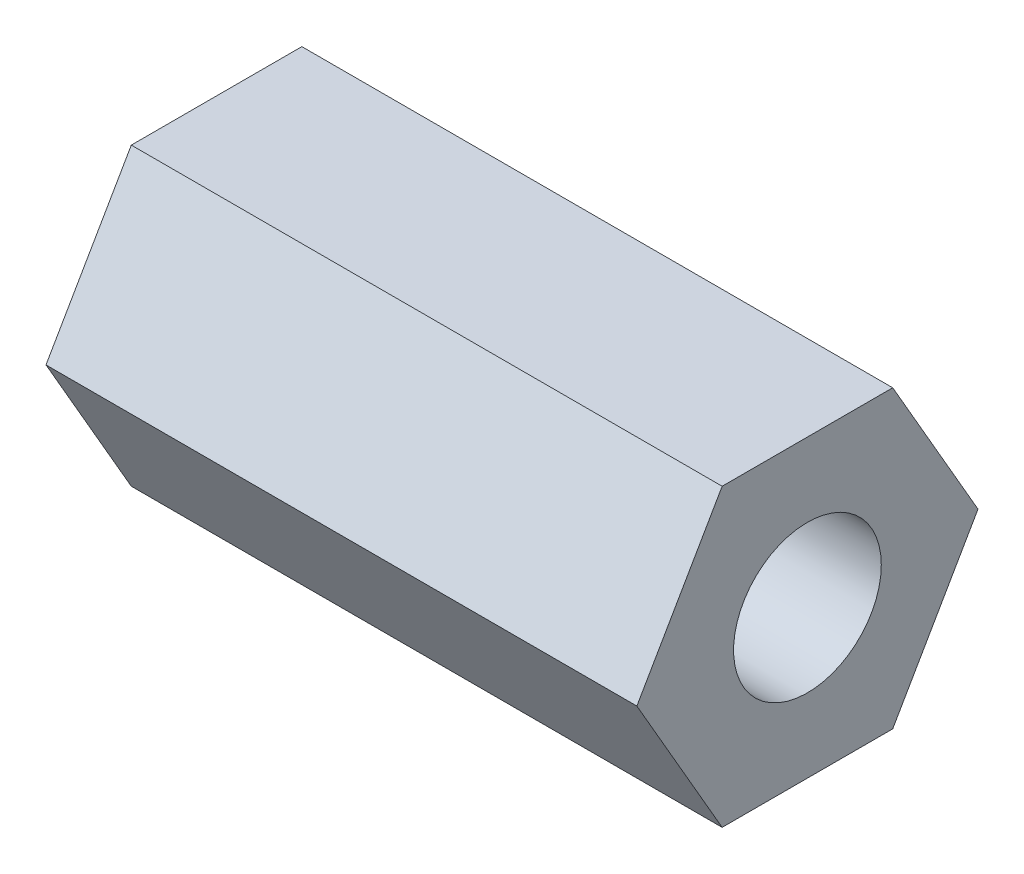
ISO-10303-21;
HEADER;
FILE_DESCRIPTION(('STEP AP214'),'2;1');
FILE_NAME('part.step','',(''),(''),'','','');
FILE_SCHEMA(('AUTOMOTIVE_DESIGN { 1 0 10303 214 1 1 1 1 }'));
ENDSEC;
DATA;
#1=APPLICATION_CONTEXT('core data for automotive mechanical design processes');
#2=APPLICATION_PROTOCOL_DEFINITION('international standard','automotive_design',2000,#1);
#3=PRODUCT_CONTEXT('',#1,'mechanical');
#4=PRODUCT('Part','Part','',(#3));
#5=PRODUCT_RELATED_PRODUCT_CATEGORY('part','',(#4));
#6=PRODUCT_DEFINITION_FORMATION('','',#4);
#7=PRODUCT_DEFINITION_CONTEXT('part definition',#1,'design');
#8=PRODUCT_DEFINITION('design','',#6,#7);
#9=PRODUCT_DEFINITION_SHAPE('','',#8);
#10=(LENGTH_UNIT() NAMED_UNIT(*) SI_UNIT(.MILLI.,.METRE.));
#11=(NAMED_UNIT(*) PLANE_ANGLE_UNIT() SI_UNIT($,.RADIAN.));
#12=(NAMED_UNIT(*) SI_UNIT($,.STERADIAN.) SOLID_ANGLE_UNIT());
#13=UNCERTAINTY_MEASURE_WITH_UNIT(LENGTH_MEASURE(1.E-05),#10,'distance_accuracy_value','');
#14=(GEOMETRIC_REPRESENTATION_CONTEXT(3) GLOBAL_UNCERTAINTY_ASSIGNED_CONTEXT((#13)) GLOBAL_UNIT_ASSIGNED_CONTEXT((#10,
#11,#12)) REPRESENTATION_CONTEXT('',''));
#15=CARTESIAN_POINT('',(0.,0.,0.));
#16=DIRECTION('',(0.,0.,1.));
#17=DIRECTION('',(1.,0.,0.));
#18=AXIS2_PLACEMENT_3D('',#15,#16,#17);
#19=CARTESIAN_POINT('',(10.,0.,0.));
#20=DIRECTION('',(1.,0.,0.));
#21=DIRECTION('',(0.,0.,-1.));
#22=AXIS2_PLACEMENT_3D('',#19,#20,#21);
#23=PLANE('',#22);
#24=DIRECTION('',(0.,0.866025403784439,-0.5));
#25=VECTOR('',#24,1.);
#26=CARTESIAN_POINT('',(10.,-2.5,-1.44337567297407));
#27=LINE('',#26,#25);
#28=CARTESIAN_POINT('',(10.,-2.5,-1.44337567297407));
#29=VERTEX_POINT('',#28);
#30=CARTESIAN_POINT('',(10.,0.,-2.88675134594813));
#31=VERTEX_POINT('',#30);
#32=EDGE_CURVE('E150',#29,#31,#27,.T.);
#33=ORIENTED_EDGE('',*,*,#32,.T.);
#34=DIRECTION('',(0.,0.866025403784438,0.5));
#35=VECTOR('',#34,1.);
#36=CARTESIAN_POINT('',(10.,0.,-2.88675134594813));
#37=LINE('',#36,#35);
#38=CARTESIAN_POINT('',(10.,2.5,-1.44337567297406));
#39=VERTEX_POINT('',#38);
#40=EDGE_CURVE('E98',#31,#39,#37,.T.);
#41=ORIENTED_EDGE('',*,*,#40,.T.);
#42=DIRECTION('',(0.,0.,1.));
#43=VECTOR('',#42,1.);
#44=CARTESIAN_POINT('',(10.,2.5,-1.44337567297406));
#45=LINE('',#44,#43);
#46=CARTESIAN_POINT('',(10.,2.5,1.44337567297406));
#47=VERTEX_POINT('',#46);
#48=EDGE_CURVE('E111',#39,#47,#45,.T.);
#49=ORIENTED_EDGE('',*,*,#48,.T.);
#50=DIRECTION('',(0.,-0.866025403784439,0.5));
#51=VECTOR('',#50,1.);
#52=CARTESIAN_POINT('',(10.,2.5,1.44337567297406));
#53=LINE('',#52,#51);
#54=CARTESIAN_POINT('',(10.,0.,2.88675134594813));
#55=VERTEX_POINT('',#54);
#56=EDGE_CURVE('E105',#47,#55,#53,.T.);
#57=ORIENTED_EDGE('',*,*,#56,.T.);
#58=DIRECTION('',(0.,-0.866025403784439,-0.5));
#59=VECTOR('',#58,1.);
#60=CARTESIAN_POINT('',(10.,0.,2.88675134594813));
#61=LINE('',#60,#59);
#62=CARTESIAN_POINT('',(10.,-2.5,1.44337567297406));
#63=VERTEX_POINT('',#62);
#64=EDGE_CURVE('E109',#55,#63,#61,.T.);
#65=ORIENTED_EDGE('',*,*,#64,.T.);
#66=DIRECTION('',(0.,0.,-1.));
#67=VECTOR('',#66,1.);
#68=CARTESIAN_POINT('',(10.,-2.5,1.44337567297406));
#69=LINE('',#68,#67);
#70=EDGE_CURVE('E61',#63,#29,#69,.T.);
#71=ORIENTED_EDGE('',*,*,#70,.T.);
#72=EDGE_LOOP('',(#33,#41,#49,#57,#65,#71));
#73=FACE_BOUND('',#72,.T.);
#74=CARTESIAN_POINT('',(10.,0.,0.));
#75=DIRECTION('',(1.,0.,0.));
#76=DIRECTION('',(0.,0.,-1.));
#77=AXIS2_PLACEMENT_3D('',#74,#75,#76);
#78=CIRCLE('',#77,1.25);
#79=CARTESIAN_POINT('',(10.,0.,-1.25));
#80=VERTEX_POINT('',#79);
#81=EDGE_CURVE('E138',#80,#80,#78,.T.);
#82=ORIENTED_EDGE('',*,*,#81,.F.);
#83=EDGE_LOOP('',(#82));
#84=FACE_BOUND('',#83,.T.);
#85=ADVANCED_FACE('F43',(#73,#84),#23,.T.);
#86=CARTESIAN_POINT('',(0.,0.,0.));
#87=DIRECTION('',(1.,0.,0.));
#88=DIRECTION('',(0.,0.,-1.));
#89=AXIS2_PLACEMENT_3D('',#86,#87,#88);
#90=PLANE('',#89);
#91=DIRECTION('',(0.,0.866025403784439,-0.5));
#92=VECTOR('',#91,1.);
#93=CARTESIAN_POINT('',(0.,-2.5,-1.44337567297407));
#94=LINE('',#93,#92);
#95=CARTESIAN_POINT('',(0.,-2.5,-1.44337567297407));
#96=VERTEX_POINT('',#95);
#97=CARTESIAN_POINT('',(0.,0.,-2.88675134594813));
#98=VERTEX_POINT('',#97);
#99=EDGE_CURVE('E133',#96,#98,#94,.T.);
#100=ORIENTED_EDGE('',*,*,#99,.F.);
#101=DIRECTION('',(0.,0.,-1.));
#102=VECTOR('',#101,1.);
#103=CARTESIAN_POINT('',(0.,-2.5,1.44337567297406));
#104=LINE('',#103,#102);
#105=CARTESIAN_POINT('',(0.,-2.5,1.44337567297406));
#106=VERTEX_POINT('',#105);
#107=EDGE_CURVE('E90',#106,#96,#104,.T.);
#108=ORIENTED_EDGE('',*,*,#107,.F.);
#109=DIRECTION('',(0.,-0.866025403784439,-0.5));
#110=VECTOR('',#109,1.);
#111=CARTESIAN_POINT('',(0.,0.,2.88675134594813));
#112=LINE('',#111,#110);
#113=CARTESIAN_POINT('',(0.,0.,2.88675134594813));
#114=VERTEX_POINT('',#113);
#115=EDGE_CURVE('E84',#114,#106,#112,.T.);
#116=ORIENTED_EDGE('',*,*,#115,.F.);
#117=DIRECTION('',(0.,-0.866025403784439,0.5));
#118=VECTOR('',#117,1.);
#119=CARTESIAN_POINT('',(0.,2.5,1.44337567297406));
#120=LINE('',#119,#118);
#121=CARTESIAN_POINT('',(0.,2.5,1.44337567297406));
#122=VERTEX_POINT('',#121);
#123=EDGE_CURVE('E120',#122,#114,#120,.T.);
#124=ORIENTED_EDGE('',*,*,#123,.F.);
#125=DIRECTION('',(0.,0.,1.));
#126=VECTOR('',#125,1.);
#127=CARTESIAN_POINT('',(0.,2.5,-1.44337567297406));
#128=LINE('',#127,#126);
#129=CARTESIAN_POINT('',(0.,2.5,-1.44337567297406));
#130=VERTEX_POINT('',#129);
#131=EDGE_CURVE('E141',#130,#122,#128,.T.);
#132=ORIENTED_EDGE('',*,*,#131,.F.);
#133=DIRECTION('',(0.,0.866025403784438,0.5));
#134=VECTOR('',#133,1.);
#135=CARTESIAN_POINT('',(0.,0.,-2.88675134594813));
#136=LINE('',#135,#134);
#137=EDGE_CURVE('E137',#98,#130,#136,.T.);
#138=ORIENTED_EDGE('',*,*,#137,.F.);
#139=EDGE_LOOP('',(#100,#108,#116,#124,#132,#138));
#140=FACE_BOUND('',#139,.T.);
#141=CARTESIAN_POINT('',(0.,0.,0.));
#142=DIRECTION('',(1.,0.,0.));
#143=DIRECTION('',(0.,0.,-1.));
#144=AXIS2_PLACEMENT_3D('',#141,#142,#143);
#145=CIRCLE('',#144,1.25);
#146=CARTESIAN_POINT('',(0.,0.,-1.25));
#147=VERTEX_POINT('',#146);
#148=EDGE_CURVE('E265',#147,#147,#145,.T.);
#149=ORIENTED_EDGE('',*,*,#148,.T.);
#150=EDGE_LOOP('',(#149));
#151=FACE_BOUND('',#150,.T.);
#152=ADVANCED_FACE('F163',(#140,#151),#90,.F.);
#153=CARTESIAN_POINT('',(10.,-2.5,-1.44337567297407));
#154=DIRECTION('',(0.,0.5,0.866025403784439));
#155=DIRECTION('',(0.,-0.866025403784439,0.5));
#156=AXIS2_PLACEMENT_3D('',#153,#154,#155);
#157=PLANE('',#156);
#158=ORIENTED_EDGE('',*,*,#99,.T.);
#159=DIRECTION('',(-1.,0.,0.));
#160=VECTOR('',#159,1.);
#161=CARTESIAN_POINT('',(10.,0.,-2.88675134594813));
#162=LINE('',#161,#160);
#163=EDGE_CURVE('E11',#31,#98,#162,.T.);
#164=ORIENTED_EDGE('',*,*,#163,.F.);
#165=ORIENTED_EDGE('',*,*,#32,.F.);
#166=DIRECTION('',(-1.,0.,0.));
#167=VECTOR('',#166,1.);
#168=CARTESIAN_POINT('',(10.,-2.5,-1.44337567297407));
#169=LINE('',#168,#167);
#170=EDGE_CURVE('E129',#29,#96,#169,.T.);
#171=ORIENTED_EDGE('',*,*,#170,.T.);
#172=EDGE_LOOP('',(#158,#164,#165,#171));
#173=FACE_BOUND('',#172,.T.);
#174=ADVANCED_FACE('F45',(#173),#157,.F.);
#175=CARTESIAN_POINT('',(10.,0.,-2.88675134594813));
#176=DIRECTION('',(0.,-0.5,0.866025403784438));
#177=DIRECTION('',(0.,-0.866025403784438,-0.5));
#178=AXIS2_PLACEMENT_3D('',#175,#176,#177);
#179=PLANE('',#178);
#180=ORIENTED_EDGE('',*,*,#137,.T.);
#181=DIRECTION('',(-1.,0.,0.));
#182=VECTOR('',#181,1.);
#183=CARTESIAN_POINT('',(10.,2.5,-1.44337567297406));
#184=LINE('',#183,#182);
#185=EDGE_CURVE('E53',#39,#130,#184,.T.);
#186=ORIENTED_EDGE('',*,*,#185,.F.);
#187=ORIENTED_EDGE('',*,*,#40,.F.);
#188=ORIENTED_EDGE('',*,*,#163,.T.);
#189=EDGE_LOOP('',(#180,#186,#187,#188));
#190=FACE_BOUND('',#189,.T.);
#191=ADVANCED_FACE('F188',(#190),#179,.F.);
#192=CARTESIAN_POINT('',(10.,2.5,-1.44337567297406));
#193=DIRECTION('',(0.,-1.,0.));
#194=DIRECTION('',(0.,0.,-1.));
#195=AXIS2_PLACEMENT_3D('',#192,#193,#194);
#196=PLANE('',#195);
#197=ORIENTED_EDGE('',*,*,#131,.T.);
#198=DIRECTION('',(-1.,0.,0.));
#199=VECTOR('',#198,1.);
#200=CARTESIAN_POINT('',(10.,2.5,1.44337567297406));
#201=LINE('',#200,#199);
#202=EDGE_CURVE('E122',#47,#122,#201,.T.);
#203=ORIENTED_EDGE('',*,*,#202,.F.);
#204=ORIENTED_EDGE('',*,*,#48,.F.);
#205=ORIENTED_EDGE('',*,*,#185,.T.);
#206=EDGE_LOOP('',(#197,#203,#204,#205));
#207=FACE_BOUND('',#206,.T.);
#208=ADVANCED_FACE('F160',(#207),#196,.F.);
#209=CARTESIAN_POINT('',(10.,2.5,1.44337567297406));
#210=DIRECTION('',(0.,-0.5,-0.866025403784439));
#211=DIRECTION('',(0.,0.866025403784439,-0.5));
#212=AXIS2_PLACEMENT_3D('',#209,#210,#211);
#213=PLANE('',#212);
#214=ORIENTED_EDGE('',*,*,#123,.T.);
#215=DIRECTION('',(-1.,0.,0.));
#216=VECTOR('',#215,1.);
#217=CARTESIAN_POINT('',(10.,0.,2.88675134594813));
#218=LINE('',#217,#216);
#219=EDGE_CURVE('E117',#55,#114,#218,.T.);
#220=ORIENTED_EDGE('',*,*,#219,.F.);
#221=ORIENTED_EDGE('',*,*,#56,.F.);
#222=ORIENTED_EDGE('',*,*,#202,.T.);
#223=EDGE_LOOP('',(#214,#220,#221,#222));
#224=FACE_BOUND('',#223,.T.);
#225=ADVANCED_FACE('F118',(#224),#213,.F.);
#226=CARTESIAN_POINT('',(10.,0.,2.88675134594813));
#227=DIRECTION('',(0.,0.5,-0.866025403784438));
#228=DIRECTION('',(0.,0.866025403784439,0.5));
#229=AXIS2_PLACEMENT_3D('',#226,#227,#228);
#230=PLANE('',#229);
#231=ORIENTED_EDGE('',*,*,#115,.T.);
#232=DIRECTION('',(-1.,0.,0.));
#233=VECTOR('',#232,1.);
#234=CARTESIAN_POINT('',(10.,-2.5,1.44337567297406));
#235=LINE('',#234,#233);
#236=EDGE_CURVE('E123',#63,#106,#235,.T.);
#237=ORIENTED_EDGE('',*,*,#236,.F.);
#238=ORIENTED_EDGE('',*,*,#64,.F.);
#239=ORIENTED_EDGE('',*,*,#219,.T.);
#240=EDGE_LOOP('',(#231,#237,#238,#239));
#241=FACE_BOUND('',#240,.T.);
#242=ADVANCED_FACE('F125',(#241),#230,.F.);
#243=CARTESIAN_POINT('',(10.,-2.5,1.44337567297406));
#244=DIRECTION('',(0.,1.,0.));
#245=DIRECTION('',(0.,0.,1.));
#246=AXIS2_PLACEMENT_3D('',#243,#244,#245);
#247=PLANE('',#246);
#248=ORIENTED_EDGE('',*,*,#107,.T.);
#249=ORIENTED_EDGE('',*,*,#170,.F.);
#250=ORIENTED_EDGE('',*,*,#70,.F.);
#251=ORIENTED_EDGE('',*,*,#236,.T.);
#252=EDGE_LOOP('',(#248,#249,#250,#251));
#253=FACE_BOUND('',#252,.T.);
#254=ADVANCED_FACE('F168',(#253),#247,.F.);
#255=CARTESIAN_POINT('',(10.,0.,0.));
#256=DIRECTION('',(-1.,0.,0.));
#257=DIRECTION('',(0.,0.,1.));
#258=AXIS2_PLACEMENT_3D('',#255,#256,#257);
#259=CYLINDRICAL_SURFACE('',#258,1.25);
#260=ORIENTED_EDGE('',*,*,#81,.T.);
#261=EDGE_LOOP('',(#260));
#262=FACE_BOUND('',#261,.T.);
#263=ORIENTED_EDGE('',*,*,#148,.F.);
#264=EDGE_LOOP('',(#263));
#265=FACE_BOUND('',#264,.T.);
#266=ADVANCED_FACE('F170',(#262,#265),#259,.F.);
#267=CLOSED_SHELL('',(#85,#152,#174,#191,#208,#225,#242,#254,#266));
#268=MANIFOLD_SOLID_BREP('B2',#267);
#269=ADVANCED_BREP_SHAPE_REPRESENTATION('',(#18,#268),#14);
#270=SHAPE_DEFINITION_REPRESENTATION(#9,#269);
ENDSEC;
END-ISO-10303-21;
